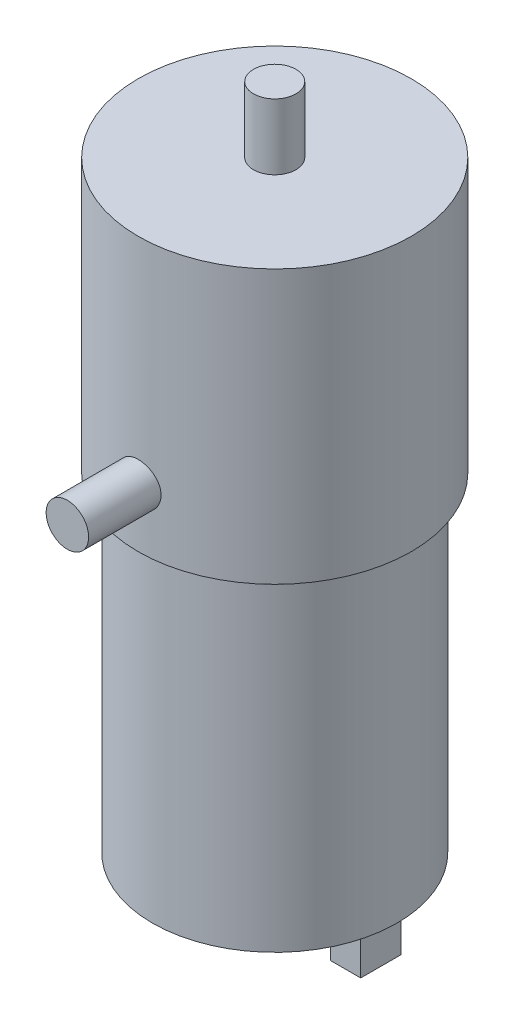
ISO-10303-21;
HEADER;
FILE_DESCRIPTION(('STEP AP214'),'2;1');
FILE_NAME('part.step','',(''),(''),'','','');
FILE_SCHEMA(('AUTOMOTIVE_DESIGN { 1 0 10303 214 1 1 1 1 }'));
ENDSEC;
DATA;
#1=APPLICATION_CONTEXT('core data for automotive mechanical design processes');
#2=APPLICATION_PROTOCOL_DEFINITION('international standard','automotive_design',2000,#1);
#3=PRODUCT_CONTEXT('',#1,'mechanical');
#4=PRODUCT('Part','Part','',(#3));
#5=PRODUCT_RELATED_PRODUCT_CATEGORY('part','',(#4));
#6=PRODUCT_DEFINITION_FORMATION('','',#4);
#7=PRODUCT_DEFINITION_CONTEXT('part definition',#1,'design');
#8=PRODUCT_DEFINITION('design','',#6,#7);
#9=PRODUCT_DEFINITION_SHAPE('','',#8);
#10=(LENGTH_UNIT() NAMED_UNIT(*) SI_UNIT(.MILLI.,.METRE.));
#11=(NAMED_UNIT(*) PLANE_ANGLE_UNIT() SI_UNIT($,.RADIAN.));
#12=(NAMED_UNIT(*) SI_UNIT($,.STERADIAN.) SOLID_ANGLE_UNIT());
#13=UNCERTAINTY_MEASURE_WITH_UNIT(LENGTH_MEASURE(1.E-05),#10,'distance_accuracy_value','');
#14=(GEOMETRIC_REPRESENTATION_CONTEXT(3) GLOBAL_UNCERTAINTY_ASSIGNED_CONTEXT((#13)) GLOBAL_UNIT_ASSIGNED_CONTEXT((#10,
#11,#12)) REPRESENTATION_CONTEXT('',''));
#15=CARTESIAN_POINT('',(0.,0.,0.));
#16=DIRECTION('',(0.,0.,1.));
#17=DIRECTION('',(1.,0.,0.));
#18=AXIS2_PLACEMENT_3D('',#15,#16,#17);
#19=CARTESIAN_POINT('',(0.,-32.5,0.));
#20=DIRECTION('',(0.,1.,0.));
#21=DIRECTION('',(0.,0.,1.));
#22=AXIS2_PLACEMENT_3D('',#19,#20,#21);
#23=PLANE('',#22);
#24=DIRECTION('',(0.,0.,-1.));
#25=VECTOR('',#24,1.);
#26=CARTESIAN_POINT('',(-10.5,-32.5,2.));
#27=LINE('',#26,#25);
#28=CARTESIAN_POINT('',(-10.5,-32.5,2.));
#29=VERTEX_POINT('',#28);
#30=CARTESIAN_POINT('',(-10.5,-32.5,-2.));
#31=VERTEX_POINT('',#30);
#32=EDGE_CURVE('E121',#29,#31,#27,.T.);
#33=ORIENTED_EDGE('',*,*,#32,.F.);
#34=DIRECTION('',(-1.,0.,0.));
#35=VECTOR('',#34,1.);
#36=CARTESIAN_POINT('',(-10.5,-32.5,2.));
#37=LINE('',#36,#35);
#38=CARTESIAN_POINT('',(-7.5,-32.5,2.));
#39=VERTEX_POINT('',#38);
#40=EDGE_CURVE('E134',#39,#29,#37,.T.);
#41=ORIENTED_EDGE('',*,*,#40,.F.);
#42=DIRECTION('',(0.,0.,1.));
#43=VECTOR('',#42,1.);
#44=CARTESIAN_POINT('',(-7.5,-32.5,2.));
#45=LINE('',#44,#43);
#46=CARTESIAN_POINT('',(-7.5,-32.5,-2.));
#47=VERTEX_POINT('',#46);
#48=EDGE_CURVE('E143',#47,#39,#45,.T.);
#49=ORIENTED_EDGE('',*,*,#48,.F.);
#50=DIRECTION('',(1.,0.,0.));
#51=VECTOR('',#50,1.);
#52=CARTESIAN_POINT('',(-10.5,-32.5,-2.));
#53=LINE('',#52,#51);
#54=EDGE_CURVE('E124',#31,#47,#53,.T.);
#55=ORIENTED_EDGE('',*,*,#54,.F.);
#56=EDGE_LOOP('',(#33,#41,#49,#55));
#57=FACE_BOUND('',#56,.T.);
#58=CARTESIAN_POINT('',(0.,-32.5,0.));
#59=DIRECTION('',(0.,1.,0.));
#60=DIRECTION('',(0.,0.,1.));
#61=AXIS2_PLACEMENT_3D('',#58,#59,#60);
#62=CIRCLE('',#61,12.1);
#63=CARTESIAN_POINT('',(0.,-32.5,12.1));
#64=VERTEX_POINT('',#63);
#65=EDGE_CURVE('E43',#64,#64,#62,.T.);
#66=ORIENTED_EDGE('',*,*,#65,.F.);
#67=EDGE_LOOP('',(#66));
#68=FACE_BOUND('',#67,.T.);
#69=DIRECTION('',(0.,0.,-1.));
#70=VECTOR('',#69,1.);
#71=CARTESIAN_POINT('',(7.5,-32.5,2.));
#72=LINE('',#71,#70);
#73=CARTESIAN_POINT('',(7.5,-32.5,2.));
#74=VERTEX_POINT('',#73);
#75=CARTESIAN_POINT('',(7.5,-32.5,-2.));
#76=VERTEX_POINT('',#75);
#77=EDGE_CURVE('E120',#74,#76,#72,.T.);
#78=ORIENTED_EDGE('',*,*,#77,.F.);
#79=DIRECTION('',(-1.,0.,0.));
#80=VECTOR('',#79,1.);
#81=CARTESIAN_POINT('',(7.5,-32.5,2.));
#82=LINE('',#81,#80);
#83=CARTESIAN_POINT('',(10.5,-32.5,2.));
#84=VERTEX_POINT('',#83);
#85=EDGE_CURVE('E117',#84,#74,#82,.T.);
#86=ORIENTED_EDGE('',*,*,#85,.F.);
#87=DIRECTION('',(0.,0.,1.));
#88=VECTOR('',#87,1.);
#89=CARTESIAN_POINT('',(10.5,-32.5,2.));
#90=LINE('',#89,#88);
#91=CARTESIAN_POINT('',(10.5,-32.5,-2.));
#92=VERTEX_POINT('',#91);
#93=EDGE_CURVE('E55',#92,#84,#90,.T.);
#94=ORIENTED_EDGE('',*,*,#93,.F.);
#95=DIRECTION('',(1.,0.,0.));
#96=VECTOR('',#95,1.);
#97=CARTESIAN_POINT('',(7.5,-32.5,-2.));
#98=LINE('',#97,#96);
#99=EDGE_CURVE('E50',#76,#92,#98,.T.);
#100=ORIENTED_EDGE('',*,*,#99,.F.);
#101=EDGE_LOOP('',(#78,#86,#94,#100));
#102=FACE_BOUND('',#101,.T.);
#103=ADVANCED_FACE('F32',(#57,#68,#102),#23,.F.);
#104=CARTESIAN_POINT('',(0.,44.1715481171548,0.));
#105=DIRECTION('',(0.,1.,0.));
#106=DIRECTION('',(0.,0.,1.));
#107=AXIS2_PLACEMENT_3D('',#104,#105,#106);
#108=CYLINDRICAL_SURFACE('',#107,13.5);
#109=CARTESIAN_POINT('',(0.,27.,0.));
#110=DIRECTION('',(0.,1.,0.));
#111=DIRECTION('',(0.,0.,1.));
#112=AXIS2_PLACEMENT_3D('',#109,#110,#111);
#113=CIRCLE('',#112,13.5);
#114=CARTESIAN_POINT('',(0.,27.,13.5));
#115=VERTEX_POINT('',#114);
#116=EDGE_CURVE('E168',#115,#115,#113,.T.);
#117=ORIENTED_EDGE('',*,*,#116,.F.);
#118=EDGE_LOOP('',(#117));
#119=FACE_BOUND('',#118,.T.);
#120=CARTESIAN_POINT('',(0.,0.,0.));
#121=DIRECTION('',(0.,1.,0.));
#122=DIRECTION('',(0.,0.,1.));
#123=AXIS2_PLACEMENT_3D('',#120,#121,#122);
#124=CIRCLE('',#123,13.5);
#125=CARTESIAN_POINT('',(0.,0.,13.5));
#126=VERTEX_POINT('',#125);
#127=EDGE_CURVE('E171',#126,#126,#124,.T.);
#128=ORIENTED_EDGE('',*,*,#127,.T.);
#129=EDGE_LOOP('',(#128));
#130=FACE_BOUND('',#129,.T.);
#131=CARTESIAN_POINT('',(0.,3.7,13.5));
#132=CARTESIAN_POINT('',(0.11719940623624,3.70000479219297,13.4999980751182));
#133=CARTESIAN_POINT('',(0.234465518676351,3.70984434429911,13.4984578477386));
#134=CARTESIAN_POINT('',(0.46571637768088,3.74893055314774,13.4924618361037));
#135=CARTESIAN_POINT('',(0.579697877516677,3.77819576829822,13.4880032638491));
#136=CARTESIAN_POINT('',(0.800999686247606,3.85523464932792,13.4766712982379));
#137=CARTESIAN_POINT('',(0.908325089015665,3.90299395383768,13.4697997790121));
#138=CARTESIAN_POINT('',(1.11342312516664,4.01562938004856,13.4544000077011));
#139=CARTESIAN_POINT('',(1.21119700716967,4.0805032603371,13.4458719726003));
#140=CARTESIAN_POINT('',(1.39525105409056,4.22610498373455,13.4280266873277));
#141=CARTESIAN_POINT('',(1.48143961392735,4.30694797036126,13.4187040027244));
#142=CARTESIAN_POINT('',(1.63908577971809,4.48194526045849,13.4003623732785));
#143=CARTESIAN_POINT('',(1.71054251256325,4.57610035233821,13.3913434464651));
#144=CARTESIAN_POINT('',(1.83705666661217,4.77566913463933,13.3745778031371));
#145=CARTESIAN_POINT('',(1.89202481939525,4.8811400569975,13.366838110173));
#146=CARTESIAN_POINT('',(1.98343087183965,5.0999580974526,13.3535818566449));
#147=CARTESIAN_POINT('',(2.01986985864737,5.21330475301952,13.3480651656567));
#148=CARTESIAN_POINT('',(2.07289736351147,5.44369080490601,13.3399331930212));
#149=CARTESIAN_POINT('',(2.08964315100886,5.56069317690854,13.3372949366872));
#150=CARTESIAN_POINT('',(2.10329624450923,5.79587464420747,13.3351488820051));
#151=CARTESIAN_POINT('',(2.10020477449501,5.91405366645389,13.3356408905159));
#152=CARTESIAN_POINT('',(2.07439949524413,6.1471190437488,13.3396787760128));
#153=CARTESIAN_POINT('',(2.05186132939983,6.26202538830625,13.3431973163566));
#154=CARTESIAN_POINT('',(1.98807760943562,6.48640544137372,13.3528490836746));
#155=CARTESIAN_POINT('',(1.94683148968727,6.59587898551389,13.358982389705));
#156=CARTESIAN_POINT('',(1.84662149483732,6.80681752305254,13.3732026012318));
#157=CARTESIAN_POINT('',(1.78758369372121,6.90824682655155,13.3812976298262));
#158=CARTESIAN_POINT('',(1.65351879799798,7.09982577238937,13.3985233861723));
#159=CARTESIAN_POINT('',(1.57849057613187,7.18997461879081,13.4076541869204));
#160=CARTESIAN_POINT('',(1.41361277977414,7.35745121853745,13.4260432465402));
#161=CARTESIAN_POINT('',(1.32361229237151,7.43463044361673,13.435301819082));
#162=CARTESIAN_POINT('',(1.13185782145802,7.57281236882966,13.4528120330479));
#163=CARTESIAN_POINT('',(1.0301037792083,7.63381498811505,13.4610636694393));
#164=CARTESIAN_POINT('',(0.817598368062627,7.73792158531913,13.4756398549653));
#165=CARTESIAN_POINT('',(0.706841029048191,7.78101356895149,13.4819631119621));
#166=CARTESIAN_POINT('',(0.479541264502168,7.8479437470169,13.4919594255068));
#167=CARTESIAN_POINT('',(0.362999260538708,7.87178334232288,13.4956326748766));
#168=CARTESIAN_POINT('',(0.128719710821349,7.89933328512423,13.4998894342712));
#169=CARTESIAN_POINT('',(0.0110067145968208,7.90324773223406,13.5005042710971));
#170=CARTESIAN_POINT('',(-0.223394216821689,7.89137877664023,13.4986603742943));
#171=CARTESIAN_POINT('',(-0.340082186087567,7.87559603118536,13.49620174322));
#172=CARTESIAN_POINT('',(-0.568498567014978,7.82495044121116,13.4885065426802));
#173=CARTESIAN_POINT('',(-0.680249673802422,7.79018755180748,13.483284530404));
#174=CARTESIAN_POINT('',(-0.896337481506004,7.70267424151328,13.4706460353863));
#175=CARTESIAN_POINT('',(-1.00067381143803,7.64992292137079,13.463229442939));
#176=CARTESIAN_POINT('',(-1.19986430136336,7.52745500639352,13.4469476805652));
#177=CARTESIAN_POINT('',(-1.2946383500142,7.45760957869728,13.4380716866495));
#178=CARTESIAN_POINT('',(-1.47119272682179,7.30311477730292,13.419891349701));
#179=CARTESIAN_POINT('',(-1.55297223894485,7.21846447458574,13.4105869798141));
#180=CARTESIAN_POINT('',(-1.70196326604791,7.035851998211,13.3924985810213));
#181=CARTESIAN_POINT('',(-1.76903760928719,6.93777728933953,13.3837199646442));
#182=CARTESIAN_POINT('',(-1.88575938062865,6.73163300409625,13.3677745539096));
#183=CARTESIAN_POINT('',(-1.93540730697213,6.62356371359268,13.3606077134718));
#184=CARTESIAN_POINT('',(-2.01565670833048,6.4008987648912,13.3487369636966));
#185=CARTESIAN_POINT('',(-2.04632910739133,6.28632917811415,13.3440238936035));
#186=CARTESIAN_POINT('',(-2.08798172916519,6.05358561905732,13.3375703979585));
#187=CARTESIAN_POINT('',(-2.09896342392433,5.93541191688734,13.3358297501936));
#188=CARTESIAN_POINT('',(-2.10088593504858,5.70018265251897,13.3355268969142));
#189=CARTESIAN_POINT('',(-2.09204250083755,5.58312884094546,13.3369304738629));
#190=CARTESIAN_POINT('',(-2.05502947311177,5.35219526593894,13.3426833552311));
#191=CARTESIAN_POINT('',(-2.02685992018012,5.23831549584125,13.347032653465));
#192=CARTESIAN_POINT('',(-1.95207265513279,5.01703006190417,13.3581746211827));
#193=CARTESIAN_POINT('',(-1.9054711545785,4.90961880417824,13.3649651430458));
#194=CARTESIAN_POINT('',(-1.79516450565629,4.70410434947397,13.3802268683742));
#195=CARTESIAN_POINT('',(-1.73145869052925,4.60600151555771,13.3886981373548));
#196=CARTESIAN_POINT('',(-1.58797236261673,4.42079446261108,13.4064763859759));
#197=CARTESIAN_POINT('',(-1.50803238715029,4.33381451223365,13.4157911039041));
#198=CARTESIAN_POINT('',(-1.33468390363868,4.17442804414216,13.4341430502575));
#199=CARTESIAN_POINT('',(-1.24127227758453,4.10202490954797,13.4431802138537));
#200=CARTESIAN_POINT('',(-1.04297620815984,3.97345960748508,13.4600205084056));
#201=CARTESIAN_POINT('',(-0.938026851382451,3.91739656629519,13.4678159824769));
#202=CARTESIAN_POINT('',(-0.720127011506088,3.82377902573187,13.4812197306887));
#203=CARTESIAN_POINT('',(-0.607184849255262,3.78620559289113,13.4868302410113));
#204=CARTESIAN_POINT('',(-0.411464407802891,3.73903969709545,13.4939692772192));
#205=CARTESIAN_POINT('',(-0.329886810557727,3.72442252625688,13.4962190321568));
#206=CARTESIAN_POINT('',(-0.165550560699335,3.70490105244539,13.4992350631421));
#207=CARTESIAN_POINT('',(-0.0827919244897994,3.69999661470231,13.5000013597737));
#208=CARTESIAN_POINT('',(0.,3.7,13.5));
#209=B_SPLINE_CURVE_WITH_KNOTS('',3,(#131,#132,#133,#134,#135,#136,#137,#138,#139,#140,#141,
#142,#143,#144,#145,#146,#147,#148,#149,#150,#151,#152,#153,#154,#155,#156,#157,#158,#159,#160,
#161,#162,#163,#164,#165,#166,#167,#168,#169,#170,#171,#172,#173,#174,#175,#176,#177,#178,#179,
#180,#181,#182,#183,#184,#185,#186,#187,#188,#189,#190,#191,#192,#193,#194,#195,#196,#197,#198,
#199,#200,#201,#202,#203,#204,#205,#206,#207,#208),.UNSPECIFIED.,.T.,.F.,(4,2,2,2,2,2,2,2,2,2,2,
2,2,2,2,2,2,2,2,2,2,2,2,2,2,2,2,2,2,2,2,2,2,2,2,2,2,2,4),(0.,0.351295656995763,
0.702927410086202,1.05428665344364,1.40559990381681,1.75954535838938,2.113511784163,
2.46936134609431,2.82519002714926,3.17815734419036,3.53110288293013,3.88089358004178,
4.23069485365775,4.58197010593775,4.93327012987619,5.28835338064361,5.64343840603075,
5.99876084096899,6.35405741904037,6.70570715146293,7.05734515047813,7.40714893400629,
7.75697020699067,8.10951386904867,8.46207966147692,8.81780613865923,9.17352244438374,
9.52790104169864,9.88225314512124,10.2327677093538,10.5832815375393,10.9334877593137,
11.2837076347835,11.6375502421877,11.9914748781691,12.3475039020557,12.703167587522,
12.951333069026,13.1994951070569),.UNSPECIFIED.);
#210=CARTESIAN_POINT('',(0.,3.7,13.5));
#211=VERTEX_POINT('',#210);
#212=EDGE_CURVE('E11',#211,#211,#209,.T.);
#213=ORIENTED_EDGE('',*,*,#212,.F.);
#214=EDGE_LOOP('',(#213));
#215=FACE_BOUND('',#214,.T.);
#216=ADVANCED_FACE('F185',(#119,#130,#215),#108,.T.);
#217=CARTESIAN_POINT('',(0.,44.1715481171548,0.));
#218=DIRECTION('',(0.,1.,0.));
#219=DIRECTION('',(0.,0.,1.));
#220=AXIS2_PLACEMENT_3D('',#217,#218,#219);
#221=CYLINDRICAL_SURFACE('',#220,12.1);
#222=CARTESIAN_POINT('',(0.,-1.,0.));
#223=DIRECTION('',(0.,1.,0.));
#224=DIRECTION('',(0.,0.,1.));
#225=AXIS2_PLACEMENT_3D('',#222,#223,#224);
#226=CIRCLE('',#225,12.1);
#227=CARTESIAN_POINT('',(0.,-1.,12.1));
#228=VERTEX_POINT('',#227);
#229=EDGE_CURVE('E177',#228,#228,#226,.T.);
#230=ORIENTED_EDGE('',*,*,#229,.F.);
#231=EDGE_LOOP('',(#230));
#232=FACE_BOUND('',#231,.T.);
#233=ORIENTED_EDGE('',*,*,#65,.T.);
#234=EDGE_LOOP('',(#233));
#235=FACE_BOUND('',#234,.T.);
#236=ADVANCED_FACE('F182',(#232,#235),#221,.T.);
#237=CARTESIAN_POINT('',(0.,-1.,0.));
#238=DIRECTION('',(0.,1.,0.));
#239=DIRECTION('',(0.,0.,1.));
#240=AXIS2_PLACEMENT_3D('',#237,#238,#239);
#241=TOROIDAL_SURFACE('',#240,11.1,0.999999999999999);
#242=CARTESIAN_POINT('',(0.,0.,0.));
#243=DIRECTION('',(0.,1.,0.));
#244=DIRECTION('',(0.,0.,1.));
#245=AXIS2_PLACEMENT_3D('',#242,#243,#244);
#246=CIRCLE('',#245,11.1);
#247=CARTESIAN_POINT('',(0.,0.,11.1));
#248=VERTEX_POINT('',#247);
#249=EDGE_CURVE('E174',#248,#248,#246,.T.);
#250=ORIENTED_EDGE('',*,*,#249,.F.);
#251=EDGE_LOOP('',(#250));
#252=FACE_BOUND('',#251,.T.);
#253=ORIENTED_EDGE('',*,*,#229,.T.);
#254=EDGE_LOOP('',(#253));
#255=FACE_BOUND('',#254,.T.);
#256=ADVANCED_FACE('F260',(#252,#255),#241,.T.);
#257=CARTESIAN_POINT('',(11.1,0.,0.));
#258=DIRECTION('',(0.,1.,0.));
#259=DIRECTION('',(0.,0.,1.));
#260=AXIS2_PLACEMENT_3D('',#257,#258,#259);
#261=PLANE('',#260);
#262=ORIENTED_EDGE('',*,*,#127,.F.);
#263=EDGE_LOOP('',(#262));
#264=FACE_BOUND('',#263,.T.);
#265=ORIENTED_EDGE('',*,*,#249,.T.);
#266=EDGE_LOOP('',(#265));
#267=FACE_BOUND('',#266,.T.);
#268=ADVANCED_FACE('F252',(#264,#267),#261,.F.);
#269=CARTESIAN_POINT('',(13.5,27.,0.));
#270=DIRECTION('',(0.,-1.,0.));
#271=DIRECTION('',(0.,0.,-1.));
#272=AXIS2_PLACEMENT_3D('',#269,#270,#271);
#273=PLANE('',#272);
#274=CARTESIAN_POINT('',(0.,27.,0.));
#275=DIRECTION('',(0.,1.,0.));
#276=DIRECTION('',(0.,0.,1.));
#277=AXIS2_PLACEMENT_3D('',#274,#275,#276);
#278=CIRCLE('',#277,2.1);
#279=CARTESIAN_POINT('',(0.,27.,2.1));
#280=VERTEX_POINT('',#279);
#281=EDGE_CURVE('E165',#280,#280,#278,.T.);
#282=ORIENTED_EDGE('',*,*,#281,.F.);
#283=EDGE_LOOP('',(#282));
#284=FACE_BOUND('',#283,.T.);
#285=ORIENTED_EDGE('',*,*,#116,.T.);
#286=EDGE_LOOP('',(#285));
#287=FACE_BOUND('',#286,.T.);
#288=ADVANCED_FACE('F249',(#284,#287),#273,.F.);
#289=CARTESIAN_POINT('',(0.,44.1715481171548,0.));
#290=DIRECTION('',(0.,1.,0.));
#291=DIRECTION('',(0.,0.,1.));
#292=AXIS2_PLACEMENT_3D('',#289,#290,#291);
#293=CYLINDRICAL_SURFACE('',#292,2.1);
#294=CARTESIAN_POINT('',(0.,33.5,0.));
#295=DIRECTION('',(0.,1.,0.));
#296=DIRECTION('',(0.,0.,1.));
#297=AXIS2_PLACEMENT_3D('',#294,#295,#296);
#298=CIRCLE('',#297,2.1);
#299=CARTESIAN_POINT('',(0.,33.5,2.1));
#300=VERTEX_POINT('',#299);
#301=EDGE_CURVE('E162',#300,#300,#298,.T.);
#302=ORIENTED_EDGE('',*,*,#301,.F.);
#303=EDGE_LOOP('',(#302));
#304=FACE_BOUND('',#303,.T.);
#305=ORIENTED_EDGE('',*,*,#281,.T.);
#306=EDGE_LOOP('',(#305));
#307=FACE_BOUND('',#306,.T.);
#308=ADVANCED_FACE('F245',(#304,#307),#293,.T.);
#309=CARTESIAN_POINT('',(2.1,33.5,0.));
#310=DIRECTION('',(0.,-1.,0.));
#311=DIRECTION('',(0.,0.,-1.));
#312=AXIS2_PLACEMENT_3D('',#309,#310,#311);
#313=PLANE('',#312);
#314=ORIENTED_EDGE('',*,*,#301,.T.);
#315=EDGE_LOOP('',(#314));
#316=FACE_BOUND('',#315,.T.);
#317=ADVANCED_FACE('F241',(#316),#313,.F.);
#318=CARTESIAN_POINT('',(0.,5.8,20.5));
#319=DIRECTION('',(0.,0.,-1.));
#320=DIRECTION('',(-1.,0.,0.));
#321=AXIS2_PLACEMENT_3D('',#318,#319,#320);
#322=CYLINDRICAL_SURFACE('',#321,2.1);
#323=CARTESIAN_POINT('',(0.,5.8,20.5));
#324=DIRECTION('',(0.,0.,1.));
#325=DIRECTION('',(1.,0.,0.));
#326=AXIS2_PLACEMENT_3D('',#323,#324,#325);
#327=CIRCLE('',#326,2.1);
#328=CARTESIAN_POINT('',(2.1,5.8,20.5));
#329=VERTEX_POINT('',#328);
#330=EDGE_CURVE('E159',#329,#329,#327,.T.);
#331=ORIENTED_EDGE('',*,*,#330,.F.);
#332=EDGE_LOOP('',(#331));
#333=FACE_BOUND('',#332,.T.);
#334=ORIENTED_EDGE('',*,*,#212,.T.);
#335=EDGE_LOOP('',(#334));
#336=FACE_BOUND('',#335,.T.);
#337=ADVANCED_FACE('F236',(#333,#336),#322,.T.);
#338=CARTESIAN_POINT('',(0.,5.8,20.5));
#339=DIRECTION('',(0.,0.,1.));
#340=DIRECTION('',(1.,0.,0.));
#341=AXIS2_PLACEMENT_3D('',#338,#339,#340);
#342=PLANE('',#341);
#343=ORIENTED_EDGE('',*,*,#330,.T.);
#344=EDGE_LOOP('',(#343));
#345=FACE_BOUND('',#344,.T.);
#346=ADVANCED_FACE('F233',(#345),#342,.T.);
#347=CARTESIAN_POINT('',(-10.5,-37.,2.));
#348=DIRECTION('',(1.,0.,0.));
#349=DIRECTION('',(0.,0.,-1.));
#350=AXIS2_PLACEMENT_3D('',#347,#348,#349);
#351=PLANE('',#350);
#352=ORIENTED_EDGE('',*,*,#32,.T.);
#353=DIRECTION('',(0.,1.,0.));
#354=VECTOR('',#353,1.);
#355=CARTESIAN_POINT('',(-10.5,-37.,-2.));
#356=LINE('',#355,#354);
#357=CARTESIAN_POINT('',(-10.5,-37.,-2.));
#358=VERTEX_POINT('',#357);
#359=EDGE_CURVE('E156',#358,#31,#356,.T.);
#360=ORIENTED_EDGE('',*,*,#359,.F.);
#361=DIRECTION('',(0.,0.,-1.));
#362=VECTOR('',#361,1.);
#363=CARTESIAN_POINT('',(-10.5,-37.,2.));
#364=LINE('',#363,#362);
#365=CARTESIAN_POINT('',(-10.5,-37.,2.));
#366=VERTEX_POINT('',#365);
#367=EDGE_CURVE('E130',#366,#358,#364,.T.);
#368=ORIENTED_EDGE('',*,*,#367,.F.);
#369=DIRECTION('',(0.,1.,0.));
#370=VECTOR('',#369,1.);
#371=CARTESIAN_POINT('',(-10.5,-37.,2.));
#372=LINE('',#371,#370);
#373=EDGE_CURVE('E139',#366,#29,#372,.T.);
#374=ORIENTED_EDGE('',*,*,#373,.T.);
#375=EDGE_LOOP('',(#352,#360,#368,#374));
#376=FACE_BOUND('',#375,.T.);
#377=ADVANCED_FACE('F229',(#376),#351,.F.);
#378=CARTESIAN_POINT('',(-10.5,-37.,-2.));
#379=DIRECTION('',(0.,0.,1.));
#380=DIRECTION('',(1.,0.,0.));
#381=AXIS2_PLACEMENT_3D('',#378,#379,#380);
#382=PLANE('',#381);
#383=ORIENTED_EDGE('',*,*,#54,.T.);
#384=DIRECTION('',(0.,1.,0.));
#385=VECTOR('',#384,1.);
#386=CARTESIAN_POINT('',(-7.5,-37.,-2.));
#387=LINE('',#386,#385);
#388=CARTESIAN_POINT('',(-7.5,-37.,-2.));
#389=VERTEX_POINT('',#388);
#390=EDGE_CURVE('E153',#389,#47,#387,.T.);
#391=ORIENTED_EDGE('',*,*,#390,.F.);
#392=DIRECTION('',(1.,0.,0.));
#393=VECTOR('',#392,1.);
#394=CARTESIAN_POINT('',(-10.5,-37.,-2.));
#395=LINE('',#394,#393);
#396=EDGE_CURVE('E133',#358,#389,#395,.T.);
#397=ORIENTED_EDGE('',*,*,#396,.F.);
#398=ORIENTED_EDGE('',*,*,#359,.T.);
#399=EDGE_LOOP('',(#383,#391,#397,#398));
#400=FACE_BOUND('',#399,.T.);
#401=ADVANCED_FACE('F225',(#400),#382,.F.);
#402=CARTESIAN_POINT('',(-7.5,-37.,2.));
#403=DIRECTION('',(-1.,0.,0.));
#404=DIRECTION('',(0.,0.,1.));
#405=AXIS2_PLACEMENT_3D('',#402,#403,#404);
#406=PLANE('',#405);
#407=ORIENTED_EDGE('',*,*,#48,.T.);
#408=DIRECTION('',(0.,1.,0.));
#409=VECTOR('',#408,1.);
#410=CARTESIAN_POINT('',(-7.5,-37.,2.));
#411=LINE('',#410,#409);
#412=CARTESIAN_POINT('',(-7.5,-37.,2.));
#413=VERTEX_POINT('',#412);
#414=EDGE_CURVE('E150',#413,#39,#411,.T.);
#415=ORIENTED_EDGE('',*,*,#414,.F.);
#416=DIRECTION('',(0.,0.,1.));
#417=VECTOR('',#416,1.);
#418=CARTESIAN_POINT('',(-7.5,-37.,2.));
#419=LINE('',#418,#417);
#420=EDGE_CURVE('E136',#389,#413,#419,.T.);
#421=ORIENTED_EDGE('',*,*,#420,.F.);
#422=ORIENTED_EDGE('',*,*,#390,.T.);
#423=EDGE_LOOP('',(#407,#415,#421,#422));
#424=FACE_BOUND('',#423,.T.);
#425=ADVANCED_FACE('F221',(#424),#406,.F.);
#426=CARTESIAN_POINT('',(-10.5,-37.,2.));
#427=DIRECTION('',(0.,0.,-1.));
#428=DIRECTION('',(-1.,0.,0.));
#429=AXIS2_PLACEMENT_3D('',#426,#427,#428);
#430=PLANE('',#429);
#431=ORIENTED_EDGE('',*,*,#40,.T.);
#432=ORIENTED_EDGE('',*,*,#373,.F.);
#433=DIRECTION('',(-1.,0.,0.));
#434=VECTOR('',#433,1.);
#435=CARTESIAN_POINT('',(-10.5,-37.,2.));
#436=LINE('',#435,#434);
#437=EDGE_CURVE('E138',#413,#366,#436,.T.);
#438=ORIENTED_EDGE('',*,*,#437,.F.);
#439=ORIENTED_EDGE('',*,*,#414,.T.);
#440=EDGE_LOOP('',(#431,#432,#438,#439));
#441=FACE_BOUND('',#440,.T.);
#442=ADVANCED_FACE('F217',(#441),#430,.F.);
#443=CARTESIAN_POINT('',(0.,-37.,0.));
#444=DIRECTION('',(0.,-1.,0.));
#445=DIRECTION('',(0.,0.,-1.));
#446=AXIS2_PLACEMENT_3D('',#443,#444,#445);
#447=PLANE('',#446);
#448=ORIENTED_EDGE('',*,*,#367,.T.);
#449=ORIENTED_EDGE('',*,*,#396,.T.);
#450=ORIENTED_EDGE('',*,*,#420,.T.);
#451=ORIENTED_EDGE('',*,*,#437,.T.);
#452=EDGE_LOOP('',(#448,#449,#450,#451));
#453=FACE_BOUND('',#452,.T.);
#454=ADVANCED_FACE('F214',(#453),#447,.T.);
#455=CARTESIAN_POINT('',(7.5,-37.,2.));
#456=DIRECTION('',(1.,0.,0.));
#457=DIRECTION('',(0.,0.,-1.));
#458=AXIS2_PLACEMENT_3D('',#455,#456,#457);
#459=PLANE('',#458);
#460=ORIENTED_EDGE('',*,*,#77,.T.);
#461=DIRECTION('',(0.,1.,0.));
#462=VECTOR('',#461,1.);
#463=CARTESIAN_POINT('',(7.5,-37.,-2.));
#464=LINE('',#463,#462);
#465=CARTESIAN_POINT('',(7.5,-37.,-2.));
#466=VERTEX_POINT('',#465);
#467=EDGE_CURVE('E101',#466,#76,#464,.T.);
#468=ORIENTED_EDGE('',*,*,#467,.F.);
#469=DIRECTION('',(0.,0.,-1.));
#470=VECTOR('',#469,1.);
#471=CARTESIAN_POINT('',(7.5,-37.,2.));
#472=LINE('',#471,#470);
#473=CARTESIAN_POINT('',(7.5,-37.,2.));
#474=VERTEX_POINT('',#473);
#475=EDGE_CURVE('E108',#474,#466,#472,.T.);
#476=ORIENTED_EDGE('',*,*,#475,.F.);
#477=DIRECTION('',(0.,1.,0.));
#478=VECTOR('',#477,1.);
#479=CARTESIAN_POINT('',(7.5,-37.,2.));
#480=LINE('',#479,#478);
#481=EDGE_CURVE('E192',#474,#74,#480,.T.);
#482=ORIENTED_EDGE('',*,*,#481,.T.);
#483=EDGE_LOOP('',(#460,#468,#476,#482));
#484=FACE_BOUND('',#483,.T.);
#485=ADVANCED_FACE('F119',(#484),#459,.F.);
#486=CARTESIAN_POINT('',(7.5,-37.,-2.));
#487=DIRECTION('',(0.,0.,1.));
#488=DIRECTION('',(1.,0.,0.));
#489=AXIS2_PLACEMENT_3D('',#486,#487,#488);
#490=PLANE('',#489);
#491=ORIENTED_EDGE('',*,*,#99,.T.);
#492=DIRECTION('',(0.,1.,0.));
#493=VECTOR('',#492,1.);
#494=CARTESIAN_POINT('',(10.5,-37.,-2.));
#495=LINE('',#494,#493);
#496=CARTESIAN_POINT('',(10.5,-37.,-2.));
#497=VERTEX_POINT('',#496);
#498=EDGE_CURVE('E104',#497,#92,#495,.T.);
#499=ORIENTED_EDGE('',*,*,#498,.F.);
#500=DIRECTION('',(1.,0.,0.));
#501=VECTOR('',#500,1.);
#502=CARTESIAN_POINT('',(7.5,-37.,-2.));
#503=LINE('',#502,#501);
#504=EDGE_CURVE('E97',#466,#497,#503,.T.);
#505=ORIENTED_EDGE('',*,*,#504,.F.);
#506=ORIENTED_EDGE('',*,*,#467,.T.);
#507=EDGE_LOOP('',(#491,#499,#505,#506));
#508=FACE_BOUND('',#507,.T.);
#509=ADVANCED_FACE('F99',(#508),#490,.F.);
#510=CARTESIAN_POINT('',(10.5,-37.,2.));
#511=DIRECTION('',(-1.,0.,0.));
#512=DIRECTION('',(0.,0.,1.));
#513=AXIS2_PLACEMENT_3D('',#510,#511,#512);
#514=PLANE('',#513);
#515=ORIENTED_EDGE('',*,*,#93,.T.);
#516=DIRECTION('',(0.,1.,0.));
#517=VECTOR('',#516,1.);
#518=CARTESIAN_POINT('',(10.5,-37.,2.));
#519=LINE('',#518,#517);
#520=CARTESIAN_POINT('',(10.5,-37.,2.));
#521=VERTEX_POINT('',#520);
#522=EDGE_CURVE('E126',#521,#84,#519,.T.);
#523=ORIENTED_EDGE('',*,*,#522,.F.);
#524=DIRECTION('',(0.,0.,1.));
#525=VECTOR('',#524,1.);
#526=CARTESIAN_POINT('',(10.5,-37.,2.));
#527=LINE('',#526,#525);
#528=EDGE_CURVE('E107',#497,#521,#527,.T.);
#529=ORIENTED_EDGE('',*,*,#528,.F.);
#530=ORIENTED_EDGE('',*,*,#498,.T.);
#531=EDGE_LOOP('',(#515,#523,#529,#530));
#532=FACE_BOUND('',#531,.T.);
#533=ADVANCED_FACE('F201',(#532),#514,.F.);
#534=CARTESIAN_POINT('',(7.5,-37.,2.));
#535=DIRECTION('',(0.,0.,-1.));
#536=DIRECTION('',(-1.,0.,0.));
#537=AXIS2_PLACEMENT_3D('',#534,#535,#536);
#538=PLANE('',#537);
#539=ORIENTED_EDGE('',*,*,#85,.T.);
#540=ORIENTED_EDGE('',*,*,#481,.F.);
#541=DIRECTION('',(-1.,0.,0.));
#542=VECTOR('',#541,1.);
#543=CARTESIAN_POINT('',(7.5,-37.,2.));
#544=LINE('',#543,#542);
#545=EDGE_CURVE('E113',#521,#474,#544,.T.);
#546=ORIENTED_EDGE('',*,*,#545,.F.);
#547=ORIENTED_EDGE('',*,*,#522,.T.);
#548=EDGE_LOOP('',(#539,#540,#546,#547));
#549=FACE_BOUND('',#548,.T.);
#550=ADVANCED_FACE('F191',(#549),#538,.F.);
#551=CARTESIAN_POINT('',(0.,-37.,0.));
#552=DIRECTION('',(0.,-1.,0.));
#553=DIRECTION('',(0.,0.,-1.));
#554=AXIS2_PLACEMENT_3D('',#551,#552,#553);
#555=PLANE('',#554);
#556=ORIENTED_EDGE('',*,*,#475,.T.);
#557=ORIENTED_EDGE('',*,*,#504,.T.);
#558=ORIENTED_EDGE('',*,*,#528,.T.);
#559=ORIENTED_EDGE('',*,*,#545,.T.);
#560=EDGE_LOOP('',(#556,#557,#558,#559));
#561=FACE_BOUND('',#560,.T.);
#562=ADVANCED_FACE('F111',(#561),#555,.T.);
#563=CLOSED_SHELL('',(#103,#216,#236,#256,#268,#288,#308,#317,#337,#346,#377,#401,#425,#442,
#454,#485,#509,#533,#550,#562));
#564=MANIFOLD_SOLID_BREP('B2',#563);
#565=ADVANCED_BREP_SHAPE_REPRESENTATION('',(#18,#564),#14);
#566=SHAPE_DEFINITION_REPRESENTATION(#9,#565);
ENDSEC;
END-ISO-10303-21;
